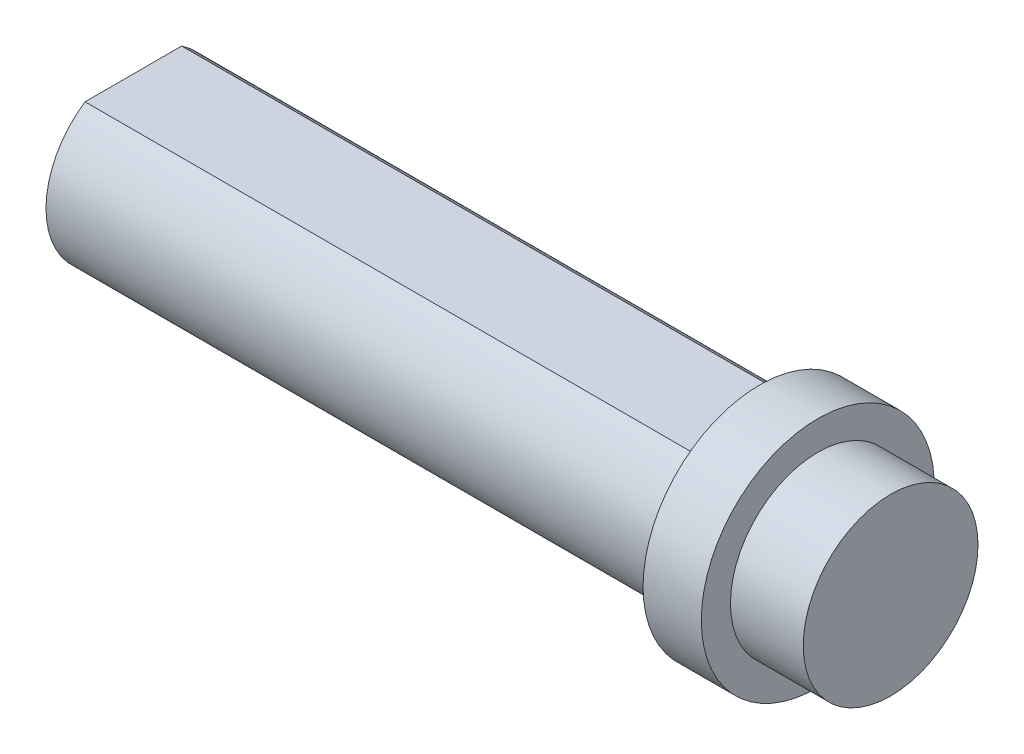
ISO-10303-21;
HEADER;
FILE_DESCRIPTION(('STEP AP214'),'2;1');
FILE_NAME('part.step','',(''),(''),'','','');
FILE_SCHEMA(('AUTOMOTIVE_DESIGN { 1 0 10303 214 1 1 1 1 }'));
ENDSEC;
DATA;
#1=APPLICATION_CONTEXT('core data for automotive mechanical design processes');
#2=APPLICATION_PROTOCOL_DEFINITION('international standard','automotive_design',2000,#1);
#3=PRODUCT_CONTEXT('',#1,'mechanical');
#4=PRODUCT('Part','Part','',(#3));
#5=PRODUCT_RELATED_PRODUCT_CATEGORY('part','',(#4));
#6=PRODUCT_DEFINITION_FORMATION('','',#4);
#7=PRODUCT_DEFINITION_CONTEXT('part definition',#1,'design');
#8=PRODUCT_DEFINITION('design','',#6,#7);
#9=PRODUCT_DEFINITION_SHAPE('','',#8);
#10=(LENGTH_UNIT() NAMED_UNIT(*) SI_UNIT(.MILLI.,.METRE.));
#11=(NAMED_UNIT(*) PLANE_ANGLE_UNIT() SI_UNIT($,.RADIAN.));
#12=(NAMED_UNIT(*) SI_UNIT($,.STERADIAN.) SOLID_ANGLE_UNIT());
#13=UNCERTAINTY_MEASURE_WITH_UNIT(LENGTH_MEASURE(1.E-05),#10,'distance_accuracy_value','');
#14=(GEOMETRIC_REPRESENTATION_CONTEXT(3) GLOBAL_UNCERTAINTY_ASSIGNED_CONTEXT((#13)) GLOBAL_UNIT_ASSIGNED_CONTEXT((#10,
#11,#12)) REPRESENTATION_CONTEXT('',''));
#15=CARTESIAN_POINT('',(0.,0.,0.));
#16=DIRECTION('',(0.,0.,1.));
#17=DIRECTION('',(1.,0.,0.));
#18=AXIS2_PLACEMENT_3D('',#15,#16,#17);
#19=CARTESIAN_POINT('',(21.5,2.5,-1.6583123951777));
#20=DIRECTION('',(0.,-1.,0.));
#21=DIRECTION('',(0.,0.,-1.));
#22=AXIS2_PLACEMENT_3D('',#19,#20,#21);
#23=PLANE('',#22);
#24=DIRECTION('',(0.,0.,-1.));
#25=VECTOR('',#24,1.);
#26=CARTESIAN_POINT('',(21.,2.5,1.66));
#27=LINE('',#26,#25);
#28=CARTESIAN_POINT('',(21.,2.5,1.6583123951777));
#29=VERTEX_POINT('',#28);
#30=CARTESIAN_POINT('',(21.,2.5,-1.6583123951777));
#31=VERTEX_POINT('',#30);
#32=EDGE_CURVE('E129',#29,#31,#27,.T.);
#33=ORIENTED_EDGE('',*,*,#32,.T.);
#34=DIRECTION('',(-1.,0.,0.));
#35=VECTOR('',#34,1.);
#36=CARTESIAN_POINT('',(21.5,2.5,-1.6583123951777));
#37=LINE('',#36,#35);
#38=CARTESIAN_POINT('',(0.,2.5,-1.6583123951777));
#39=VERTEX_POINT('',#38);
#40=EDGE_CURVE('E60',#31,#39,#37,.T.);
#41=ORIENTED_EDGE('',*,*,#40,.T.);
#42=DIRECTION('',(0.,0.,1.));
#43=VECTOR('',#42,1.);
#44=CARTESIAN_POINT('',(0.,2.5,-1.6583123951777));
#45=LINE('',#44,#43);
#46=CARTESIAN_POINT('',(0.,2.5,1.6583123951777));
#47=VERTEX_POINT('',#46);
#48=EDGE_CURVE('E136',#39,#47,#45,.T.);
#49=ORIENTED_EDGE('',*,*,#48,.T.);
#50=DIRECTION('',(-1.,0.,0.));
#51=VECTOR('',#50,1.);
#52=CARTESIAN_POINT('',(21.5,2.5,1.6583123951777));
#53=LINE('',#52,#51);
#54=EDGE_CURVE('E142',#29,#47,#53,.T.);
#55=ORIENTED_EDGE('',*,*,#54,.F.);
#56=EDGE_LOOP('',(#33,#41,#49,#55));
#57=FACE_BOUND('',#56,.T.);
#58=ADVANCED_FACE('F37',(#57),#23,.F.);
#59=CARTESIAN_POINT('',(21.5,0.,0.));
#60=DIRECTION('',(-1.,0.,0.));
#61=DIRECTION('',(0.,0.,1.));
#62=AXIS2_PLACEMENT_3D('',#59,#60,#61);
#63=PLANE('',#62);
#64=CARTESIAN_POINT('',(21.5,0.,0.));
#65=DIRECTION('',(-1.,0.,0.));
#66=DIRECTION('',(0.,0.,1.));
#67=AXIS2_PLACEMENT_3D('',#64,#65,#66);
#68=CIRCLE('',#67,4.);
#69=CARTESIAN_POINT('',(21.5,0.,4.));
#70=VERTEX_POINT('',#69);
#71=EDGE_CURVE('E132',#70,#70,#68,.T.);
#72=ORIENTED_EDGE('',*,*,#71,.T.);
#73=EDGE_LOOP('',(#72));
#74=FACE_BOUND('',#73,.T.);
#75=DIRECTION('',(0.,1.,0.));
#76=VECTOR('',#75,1.);
#77=CARTESIAN_POINT('',(21.5,2.75,1.66));
#78=LINE('',#77,#76);
#79=CARTESIAN_POINT('',(21.5,2.5,1.66));
#80=VERTEX_POINT('',#79);
#81=CARTESIAN_POINT('',(21.5,2.75,1.66));
#82=VERTEX_POINT('',#81);
#83=EDGE_CURVE('E96',#80,#82,#78,.T.);
#84=ORIENTED_EDGE('',*,*,#83,.F.);
#85=DIRECTION('',(0.,0.,-1.));
#86=VECTOR('',#85,1.);
#87=CARTESIAN_POINT('',(21.5,2.5,1.66));
#88=LINE('',#87,#86);
#89=CARTESIAN_POINT('',(21.5,2.5,1.6583123951777));
#90=VERTEX_POINT('',#89);
#91=EDGE_CURVE('E104',#80,#90,#88,.T.);
#92=ORIENTED_EDGE('',*,*,#91,.T.);
#93=CARTESIAN_POINT('',(21.5,0.,0.));
#94=DIRECTION('',(-1.,0.,0.));
#95=DIRECTION('',(0.,0.,1.));
#96=AXIS2_PLACEMENT_3D('',#93,#94,#95);
#97=CIRCLE('',#96,3.);
#98=CARTESIAN_POINT('',(21.5,2.5,-1.6583123951777));
#99=VERTEX_POINT('',#98);
#100=EDGE_CURVE('E111',#99,#90,#97,.T.);
#101=ORIENTED_EDGE('',*,*,#100,.F.);
#102=DIRECTION('',(0.,0.,-1.));
#103=VECTOR('',#102,1.);
#104=CARTESIAN_POINT('',(21.5,2.5,0.));
#105=LINE('',#104,#103);
#106=CARTESIAN_POINT('',(21.5,2.5,-1.66));
#107=VERTEX_POINT('',#106);
#108=EDGE_CURVE('E11',#99,#107,#105,.T.);
#109=ORIENTED_EDGE('',*,*,#108,.T.);
#110=DIRECTION('',(0.,1.,0.));
#111=VECTOR('',#110,1.);
#112=CARTESIAN_POINT('',(21.5,2.75,-1.66));
#113=LINE('',#112,#111);
#114=CARTESIAN_POINT('',(21.5,2.75,-1.66));
#115=VERTEX_POINT('',#114);
#116=EDGE_CURVE('E124',#107,#115,#113,.T.);
#117=ORIENTED_EDGE('',*,*,#116,.T.);
#118=DIRECTION('',(0.,0.,-1.));
#119=VECTOR('',#118,1.);
#120=CARTESIAN_POINT('',(21.5,2.75,1.66));
#121=LINE('',#120,#119);
#122=EDGE_CURVE('E112',#82,#115,#121,.T.);
#123=ORIENTED_EDGE('',*,*,#122,.F.);
#124=EDGE_LOOP('',(#84,#92,#101,#109,#117,#123));
#125=FACE_BOUND('',#124,.T.);
#126=ADVANCED_FACE('F115',(#74,#125),#63,.T.);
#127=CARTESIAN_POINT('',(26.,0.,0.));
#128=DIRECTION('',(-1.,0.,0.));
#129=DIRECTION('',(0.,0.,1.));
#130=AXIS2_PLACEMENT_3D('',#127,#128,#129);
#131=CYLINDRICAL_SURFACE('',#130,3.);
#132=CARTESIAN_POINT('',(26.,0.,0.));
#133=DIRECTION('',(1.,0.,0.));
#134=DIRECTION('',(0.,0.,-1.));
#135=AXIS2_PLACEMENT_3D('',#132,#133,#134);
#136=CIRCLE('',#135,3.);
#137=CARTESIAN_POINT('',(26.,0.,3.));
#138=VERTEX_POINT('',#137);
#139=EDGE_CURVE('E145',#138,#138,#136,.T.);
#140=CARTESIAN_POINT('',(23.5,0.,0.));
#141=DIRECTION('',(-1.,0.,0.));
#142=DIRECTION('',(0.,0.,1.));
#143=AXIS2_PLACEMENT_3D('',#140,#141,#142);
#144=CIRCLE('',#143,3.);
#145=CARTESIAN_POINT('',(23.5,0.,3.));
#146=VERTEX_POINT('',#145);
#147=EDGE_CURVE('E45',#146,#146,#144,.T.);
#148=CARTESIAN_POINT('',(26.,0.,3.));
#149=CARTESIAN_POINT('',(25.9739583333333,0.,3.));
#150=CARTESIAN_POINT('',(25.9479166666667,0.,3.));
#151=CARTESIAN_POINT('',(25.8958333333333,0.,3.));
#152=CARTESIAN_POINT('',(25.8697916666667,0.,3.));
#153=CARTESIAN_POINT('',(25.8177083333333,0.,3.));
#154=CARTESIAN_POINT('',(25.7916666666667,0.,3.));
#155=CARTESIAN_POINT('',(25.7395833333333,0.,3.));
#156=CARTESIAN_POINT('',(25.7135416666667,0.,3.));
#157=CARTESIAN_POINT('',(25.6614583333333,0.,3.));
#158=CARTESIAN_POINT('',(25.6354166666667,0.,3.));
#159=CARTESIAN_POINT('',(25.5833333333333,0.,3.));
#160=CARTESIAN_POINT('',(25.5572916666667,0.,3.));
#161=CARTESIAN_POINT('',(25.5052083333333,0.,3.));
#162=CARTESIAN_POINT('',(25.4791666666667,0.,3.));
#163=CARTESIAN_POINT('',(25.4270833333333,0.,3.));
#164=CARTESIAN_POINT('',(25.4010416666667,0.,3.));
#165=CARTESIAN_POINT('',(25.3489583333333,0.,3.));
#166=CARTESIAN_POINT('',(25.3229166666667,0.,3.));
#167=CARTESIAN_POINT('',(25.2708333333333,0.,3.));
#168=CARTESIAN_POINT('',(25.2447916666667,0.,3.));
#169=CARTESIAN_POINT('',(25.1927083333333,0.,3.));
#170=CARTESIAN_POINT('',(25.1666666666667,0.,3.));
#171=CARTESIAN_POINT('',(25.1145833333333,0.,3.));
#172=CARTESIAN_POINT('',(25.0885416666667,0.,3.));
#173=CARTESIAN_POINT('',(25.0364583333333,0.,3.));
#174=CARTESIAN_POINT('',(25.0104166666667,0.,3.));
#175=CARTESIAN_POINT('',(24.9583333333333,0.,3.));
#176=CARTESIAN_POINT('',(24.9322916666667,0.,3.));
#177=CARTESIAN_POINT('',(24.8802083333333,0.,3.));
#178=CARTESIAN_POINT('',(24.8541666666667,0.,3.));
#179=CARTESIAN_POINT('',(24.8020833333333,0.,3.));
#180=CARTESIAN_POINT('',(24.7760416666667,0.,3.));
#181=CARTESIAN_POINT('',(24.7239583333333,0.,3.));
#182=CARTESIAN_POINT('',(24.6979166666667,0.,3.));
#183=CARTESIAN_POINT('',(24.6458333333333,0.,3.));
#184=CARTESIAN_POINT('',(24.6197916666667,0.,3.));
#185=CARTESIAN_POINT('',(24.5677083333333,0.,3.));
#186=CARTESIAN_POINT('',(24.5416666666667,0.,3.));
#187=CARTESIAN_POINT('',(24.4895833333333,0.,3.));
#188=CARTESIAN_POINT('',(24.4635416666667,0.,3.));
#189=CARTESIAN_POINT('',(24.4114583333333,0.,3.));
#190=CARTESIAN_POINT('',(24.3854166666667,0.,3.));
#191=CARTESIAN_POINT('',(24.3333333333333,0.,3.));
#192=CARTESIAN_POINT('',(24.3072916666667,0.,3.));
#193=CARTESIAN_POINT('',(24.2552083333333,0.,3.));
#194=CARTESIAN_POINT('',(24.2291666666667,0.,3.));
#195=CARTESIAN_POINT('',(24.1770833333333,0.,3.));
#196=CARTESIAN_POINT('',(24.1510416666667,0.,3.));
#197=CARTESIAN_POINT('',(24.0989583333333,0.,3.));
#198=CARTESIAN_POINT('',(24.0729166666667,0.,3.));
#199=CARTESIAN_POINT('',(24.0208333333333,0.,3.));
#200=CARTESIAN_POINT('',(23.9947916666667,0.,3.));
#201=CARTESIAN_POINT('',(23.9427083333333,0.,3.));
#202=CARTESIAN_POINT('',(23.9166666666667,0.,3.));
#203=CARTESIAN_POINT('',(23.8645833333333,0.,3.));
#204=CARTESIAN_POINT('',(23.8385416666667,0.,3.));
#205=CARTESIAN_POINT('',(23.7864583333333,0.,3.));
#206=CARTESIAN_POINT('',(23.7604166666667,0.,3.));
#207=CARTESIAN_POINT('',(23.7083333333333,0.,3.));
#208=CARTESIAN_POINT('',(23.6822916666667,0.,3.));
#209=CARTESIAN_POINT('',(23.6302083333333,0.,3.));
#210=CARTESIAN_POINT('',(23.6041666666667,0.,3.));
#211=CARTESIAN_POINT('',(23.5520833333333,0.,3.));
#212=CARTESIAN_POINT('',(23.5260416666667,0.,3.));
#213=CARTESIAN_POINT('',(23.5,0.,3.));
#214=B_SPLINE_CURVE_WITH_KNOTS('',3,(#148,#149,#150,#151,#152,#153,#154,#155,#156,#157,#158,
#159,#160,#161,#162,#163,#164,#165,#166,#167,#168,#169,#170,#171,#172,#173,#174,#175,#176,#177,
#178,#179,#180,#181,#182,#183,#184,#185,#186,#187,#188,#189,#190,#191,#192,#193,#194,#195,#196,
#197,#198,#199,#200,#201,#202,#203,#204,#205,#206,#207,#208,#209,#210,#211,#212,#213),
.UNSPECIFIED.,.F.,.F.,(4,2,2,2,2,2,2,2,2,2,2,2,2,2,2,2,2,2,2,2,2,2,2,2,2,2,2,2,2,2,2,2,4),(0.,
0.0781249999999983,0.156249999999997,0.234374999999998,0.312499999999997,0.390624999999999,
0.468749999999997,0.546874999999999,0.624999999999997,0.703124999999995,0.781249999999997,
0.859374999999996,0.937499999999997,1.015625,1.09375,1.171875,1.24999999999999,1.328125,
1.40624999999999,1.484375,1.56249999999999,1.640625,1.71874999999999,1.796875,1.87499999999999,
1.95312499999999,2.03124999999999,2.10937499999999,2.1875,2.26562499999999,2.34374999999999,
2.42187499999999,2.49999999999999),.UNSPECIFIED.);
#215=EDGE_CURVE('BSEAM155',#138,#146,#214,.T.);
#216=ORIENTED_EDGE('',*,*,#139,.F.);
#217=ORIENTED_EDGE('',*,*,#147,.F.);
#218=ORIENTED_EDGE('',*,*,#215,.T.);
#219=ORIENTED_EDGE('',*,*,#215,.F.);
#220=EDGE_LOOP('',(#216,#218,#217,#219));
#221=FACE_BOUND('',#220,.T.);
#222=ADVANCED_FACE('F155',(#221),#131,.T.);
#223=CARTESIAN_POINT('',(26.,0.,0.));
#224=DIRECTION('',(1.,0.,0.));
#225=DIRECTION('',(0.,0.,-1.));
#226=AXIS2_PLACEMENT_3D('',#223,#224,#225);
#227=PLANE('',#226);
#228=ORIENTED_EDGE('',*,*,#139,.T.);
#229=EDGE_LOOP('',(#228));
#230=FACE_BOUND('',#229,.T.);
#231=ADVANCED_FACE('F157',(#230),#227,.T.);
#232=CARTESIAN_POINT('',(23.5,0.,0.));
#233=DIRECTION('',(-1.,0.,0.));
#234=DIRECTION('',(0.,0.,1.));
#235=AXIS2_PLACEMENT_3D('',#232,#233,#234);
#236=CYLINDRICAL_SURFACE('',#235,4.);
#237=CARTESIAN_POINT('',(23.5,0.,0.));
#238=DIRECTION('',(-1.,0.,0.));
#239=DIRECTION('',(0.,0.,1.));
#240=AXIS2_PLACEMENT_3D('',#237,#238,#239);
#241=CIRCLE('',#240,4.);
#242=CARTESIAN_POINT('',(23.5,0.,4.));
#243=VERTEX_POINT('',#242);
#244=EDGE_CURVE('E133',#243,#243,#241,.T.);
#245=ORIENTED_EDGE('',*,*,#244,.T.);
#246=EDGE_LOOP('',(#245));
#247=FACE_BOUND('',#246,.T.);
#248=ORIENTED_EDGE('',*,*,#71,.F.);
#249=EDGE_LOOP('',(#248));
#250=FACE_BOUND('',#249,.T.);
#251=ADVANCED_FACE('F164',(#247,#250),#236,.T.);
#252=CARTESIAN_POINT('',(23.5,0.,0.));
#253=DIRECTION('',(-1.,0.,0.));
#254=DIRECTION('',(0.,0.,1.));
#255=AXIS2_PLACEMENT_3D('',#252,#253,#254);
#256=PLANE('',#255);
#257=ORIENTED_EDGE('',*,*,#147,.T.);
#258=EDGE_LOOP('',(#257));
#259=FACE_BOUND('',#258,.T.);
#260=ORIENTED_EDGE('',*,*,#244,.F.);
#261=EDGE_LOOP('',(#260));
#262=FACE_BOUND('',#261,.T.);
#263=ADVANCED_FACE('F152',(#259,#262),#256,.F.);
#264=CARTESIAN_POINT('',(0.,0.,0.));
#265=DIRECTION('',(1.,0.,0.));
#266=DIRECTION('',(0.,0.,-1.));
#267=AXIS2_PLACEMENT_3D('',#264,#265,#266);
#268=PLANE('',#267);
#269=CARTESIAN_POINT('',(0.,0.,0.));
#270=DIRECTION('',(1.,0.,0.));
#271=DIRECTION('',(0.,0.,-1.));
#272=AXIS2_PLACEMENT_3D('',#269,#270,#271);
#273=CIRCLE('',#272,3.);
#274=EDGE_CURVE('E141',#47,#39,#273,.T.);
#275=ORIENTED_EDGE('',*,*,#274,.F.);
#276=ORIENTED_EDGE('',*,*,#48,.F.);
#277=EDGE_LOOP('',(#275,#276));
#278=FACE_BOUND('',#277,.T.);
#279=ADVANCED_FACE('F173',(#278),#268,.F.);
#280=EDGE_CURVE('E143',#99,#31,#37,.T.);
#281=ORIENTED_EDGE('',*,*,#280,.F.);
#282=ORIENTED_EDGE('',*,*,#100,.T.);
#283=EDGE_CURVE('E107',#90,#29,#53,.T.);
#284=ORIENTED_EDGE('',*,*,#283,.T.);
#285=ORIENTED_EDGE('',*,*,#54,.T.);
#286=ORIENTED_EDGE('',*,*,#274,.T.);
#287=ORIENTED_EDGE('',*,*,#40,.F.);
#288=EDGE_LOOP('',(#281,#282,#284,#285,#286,#287));
#289=FACE_BOUND('',#288,.T.);
#290=ADVANCED_FACE('F39',(#289),#131,.T.);
#291=CARTESIAN_POINT('',(21.5,2.5,1.66));
#292=DIRECTION('',(0.,1.,0.));
#293=DIRECTION('',(0.,0.,1.));
#294=AXIS2_PLACEMENT_3D('',#291,#292,#293);
#295=PLANE('',#294);
#296=ORIENTED_EDGE('',*,*,#108,.F.);
#297=ORIENTED_EDGE('',*,*,#280,.T.);
#298=CARTESIAN_POINT('',(21.,2.5,-1.66));
#299=VERTEX_POINT('',#298);
#300=EDGE_CURVE('E118',#31,#299,#27,.T.);
#301=ORIENTED_EDGE('',*,*,#300,.T.);
#302=DIRECTION('',(1.,0.,0.));
#303=VECTOR('',#302,1.);
#304=CARTESIAN_POINT('',(21.5,2.5,-1.66));
#305=LINE('',#304,#303);
#306=EDGE_CURVE('E121',#299,#107,#305,.T.);
#307=ORIENTED_EDGE('',*,*,#306,.T.);
#308=EDGE_LOOP('',(#296,#297,#301,#307));
#309=FACE_BOUND('',#308,.T.);
#310=ADVANCED_FACE('F172',(#309),#295,.F.);
#311=CARTESIAN_POINT('',(21.,2.5,1.66));
#312=VERTEX_POINT('',#311);
#313=EDGE_CURVE('E127',#312,#29,#27,.T.);
#314=ORIENTED_EDGE('',*,*,#313,.T.);
#315=ORIENTED_EDGE('',*,*,#283,.F.);
#316=ORIENTED_EDGE('',*,*,#91,.F.);
#317=DIRECTION('',(1.,0.,0.));
#318=VECTOR('',#317,1.);
#319=CARTESIAN_POINT('',(21.5,2.5,1.66));
#320=LINE('',#319,#318);
#321=EDGE_CURVE('E92',#312,#80,#320,.T.);
#322=ORIENTED_EDGE('',*,*,#321,.F.);
#323=EDGE_LOOP('',(#314,#315,#316,#322));
#324=FACE_BOUND('',#323,.T.);
#325=ADVANCED_FACE('F105',(#324),#295,.F.);
#326=CARTESIAN_POINT('',(21.,2.5,1.66));
#327=DIRECTION('',(0.447213595499957,-0.894427190999916,0.));
#328=DIRECTION('',(0.894427190999916,0.447213595499957,0.));
#329=AXIS2_PLACEMENT_3D('',#326,#327,#328);
#330=PLANE('',#329);
#331=DIRECTION('',(-0.894427190999916,-0.447213595499957,0.));
#332=VECTOR('',#331,1.);
#333=CARTESIAN_POINT('',(21.,2.5,-1.66));
#334=LINE('',#333,#332);
#335=EDGE_CURVE('E52',#115,#299,#334,.T.);
#336=ORIENTED_EDGE('',*,*,#335,.T.);
#337=ORIENTED_EDGE('',*,*,#300,.F.);
#338=ORIENTED_EDGE('',*,*,#32,.F.);
#339=ORIENTED_EDGE('',*,*,#313,.F.);
#340=DIRECTION('',(-0.894427190999916,-0.447213595499957,0.));
#341=VECTOR('',#340,1.);
#342=CARTESIAN_POINT('',(21.,2.5,1.66));
#343=LINE('',#342,#341);
#344=EDGE_CURVE('E98',#82,#312,#343,.T.);
#345=ORIENTED_EDGE('',*,*,#344,.F.);
#346=ORIENTED_EDGE('',*,*,#122,.T.);
#347=EDGE_LOOP('',(#336,#337,#338,#339,#345,#346));
#348=FACE_BOUND('',#347,.T.);
#349=ADVANCED_FACE('F193',(#348),#330,.F.);
#350=CARTESIAN_POINT('',(0.,0.,1.66));
#351=DIRECTION('',(0.,0.,1.));
#352=DIRECTION('',(1.,0.,0.));
#353=AXIS2_PLACEMENT_3D('',#350,#351,#352);
#354=PLANE('',#353);
#355=ORIENTED_EDGE('',*,*,#321,.T.);
#356=ORIENTED_EDGE('',*,*,#83,.T.);
#357=ORIENTED_EDGE('',*,*,#344,.T.);
#358=EDGE_LOOP('',(#355,#356,#357));
#359=FACE_BOUND('',#358,.T.);
#360=ADVANCED_FACE('F94',(#359),#354,.T.);
#361=CARTESIAN_POINT('',(0.,0.,-1.66));
#362=DIRECTION('',(0.,0.,1.));
#363=DIRECTION('',(1.,0.,0.));
#364=AXIS2_PLACEMENT_3D('',#361,#362,#363);
#365=PLANE('',#364);
#366=ORIENTED_EDGE('',*,*,#306,.F.);
#367=ORIENTED_EDGE('',*,*,#335,.F.);
#368=ORIENTED_EDGE('',*,*,#116,.F.);
#369=EDGE_LOOP('',(#366,#367,#368));
#370=FACE_BOUND('',#369,.T.);
#371=ADVANCED_FACE('F194',(#370),#365,.F.);
#372=CLOSED_SHELL('',(#58,#126,#222,#231,#251,#263,#279,#290,#310,#325,#349,#360,#371));
#373=MANIFOLD_SOLID_BREP('B2',#372);
#374=ADVANCED_BREP_SHAPE_REPRESENTATION('',(#18,#373),#14);
#375=SHAPE_DEFINITION_REPRESENTATION(#9,#374);
ENDSEC;
END-ISO-10303-21;
